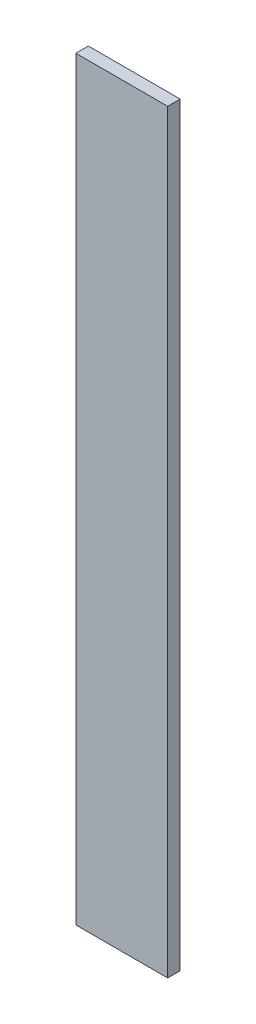
ISO-10303-21;
HEADER;
FILE_DESCRIPTION(('STEP AP214'),'2;1');
FILE_NAME('part.step','',(''),(''),'','','');
FILE_SCHEMA(('AUTOMOTIVE_DESIGN { 1 0 10303 214 1 1 1 1 }'));
ENDSEC;
DATA;
#1=APPLICATION_CONTEXT('core data for automotive mechanical design processes');
#2=APPLICATION_PROTOCOL_DEFINITION('international standard','automotive_design',2000,#1);
#3=PRODUCT_CONTEXT('',#1,'mechanical');
#4=PRODUCT('Part','Part','',(#3));
#5=PRODUCT_RELATED_PRODUCT_CATEGORY('part','',(#4));
#6=PRODUCT_DEFINITION_FORMATION('','',#4);
#7=PRODUCT_DEFINITION_CONTEXT('part definition',#1,'design');
#8=PRODUCT_DEFINITION('design','',#6,#7);
#9=PRODUCT_DEFINITION_SHAPE('','',#8);
#10=(LENGTH_UNIT() NAMED_UNIT(*) SI_UNIT(.MILLI.,.METRE.));
#11=(NAMED_UNIT(*) PLANE_ANGLE_UNIT() SI_UNIT($,.RADIAN.));
#12=(NAMED_UNIT(*) SI_UNIT($,.STERADIAN.) SOLID_ANGLE_UNIT());
#13=UNCERTAINTY_MEASURE_WITH_UNIT(LENGTH_MEASURE(1.E-05),#10,'distance_accuracy_value','');
#14=(GEOMETRIC_REPRESENTATION_CONTEXT(3) GLOBAL_UNCERTAINTY_ASSIGNED_CONTEXT((#13)) GLOBAL_UNIT_ASSIGNED_CONTEXT((#10,
#11,#12)) REPRESENTATION_CONTEXT('',''));
#15=CARTESIAN_POINT('',(0.,0.,0.));
#16=DIRECTION('',(0.,0.,1.));
#17=DIRECTION('',(1.,0.,0.));
#18=AXIS2_PLACEMENT_3D('',#15,#16,#17);
#19=CARTESIAN_POINT('',(0.,0.,0.1143));
#20=DIRECTION('',(0.,0.,1.));
#21=DIRECTION('',(1.,0.,0.));
#22=AXIS2_PLACEMENT_3D('',#19,#20,#21);
#23=PLANE('',#22);
#24=DIRECTION('',(0.,1.,0.));
#25=VECTOR('',#24,1.);
#26=CARTESIAN_POINT('',(-6.60999999999896,1.71999999999998,0.1143));
#27=LINE('',#26,#25);
#28=CARTESIAN_POINT('',(-6.60999999999896,4.01999999999916,0.1143));
#29=VERTEX_POINT('',#28);
#30=CARTESIAN_POINT('',(-6.60999999999896,1.71999999999998,0.1143));
#31=VERTEX_POINT('',#30);
#32=EDGE_CURVE('E68',#29,#31,#27,.F.);
#33=ORIENTED_EDGE('',*,*,#32,.F.);
#34=DIRECTION('',(1.,0.,0.));
#35=VECTOR('',#34,1.);
#36=CARTESIAN_POINT('',(-6.60999999999896,4.01999999999916,0.1143));
#37=LINE('',#36,#35);
#38=CARTESIAN_POINT('',(-6.89000000000038,4.01999999999916,0.1143));
#39=VERTEX_POINT('',#38);
#40=EDGE_CURVE('E20',#39,#29,#37,.T.);
#41=ORIENTED_EDGE('',*,*,#40,.F.);
#42=DIRECTION('',(0.,1.,0.));
#43=VECTOR('',#42,1.);
#44=CARTESIAN_POINT('',(-6.89000000000038,4.01999999999916,0.1143));
#45=LINE('',#44,#43);
#46=CARTESIAN_POINT('',(-6.89000000000038,1.71999999999998,0.1143));
#47=VERTEX_POINT('',#46);
#48=EDGE_CURVE('E58',#47,#39,#45,.T.);
#49=ORIENTED_EDGE('',*,*,#48,.F.);
#50=DIRECTION('',(1.,0.,0.));
#51=VECTOR('',#50,1.);
#52=CARTESIAN_POINT('',(-6.89000000000038,1.71999999999998,0.1143));
#53=LINE('',#52,#51);
#54=EDGE_CURVE('E53',#31,#47,#53,.F.);
#55=ORIENTED_EDGE('',*,*,#54,.F.);
#56=EDGE_LOOP('',(#33,#41,#49,#55));
#57=FACE_BOUND('',#56,.T.);
#58=ADVANCED_FACE('F17',(#57),#23,.T.);
#59=CARTESIAN_POINT('',(-6.60999999999896,4.01999999999916,0.0762));
#60=DIRECTION('',(0.,1.,0.));
#61=DIRECTION('',(0.,0.,1.));
#62=AXIS2_PLACEMENT_3D('',#59,#60,#61);
#63=PLANE('',#62);
#64=DIRECTION('',(0.,0.,-1.));
#65=VECTOR('',#64,1.);
#66=CARTESIAN_POINT('',(-6.60999999999896,4.01999999999916,0.0762));
#67=LINE('',#66,#65);
#68=CARTESIAN_POINT('',(-6.60999999999896,4.01999999999916,0.0762));
#69=VERTEX_POINT('',#68);
#70=EDGE_CURVE('E79',#69,#29,#67,.F.);
#71=ORIENTED_EDGE('',*,*,#70,.F.);
#72=DIRECTION('',(1.,0.,0.));
#73=VECTOR('',#72,1.);
#74=CARTESIAN_POINT('',(7.251827,4.01999999999916,0.0762));
#75=LINE('',#74,#73);
#76=CARTESIAN_POINT('',(-6.89000000000038,4.01999999999916,0.0762));
#77=VERTEX_POINT('',#76);
#78=EDGE_CURVE('E74',#69,#77,#75,.F.);
#79=ORIENTED_EDGE('',*,*,#78,.T.);
#80=DIRECTION('',(0.,0.,1.));
#81=VECTOR('',#80,1.);
#82=CARTESIAN_POINT('',(-6.89000000000038,4.01999999999916,0.0762));
#83=LINE('',#82,#81);
#84=EDGE_CURVE('E63',#39,#77,#83,.F.);
#85=ORIENTED_EDGE('',*,*,#84,.F.);
#86=ORIENTED_EDGE('',*,*,#40,.T.);
#87=EDGE_LOOP('',(#71,#79,#85,#86));
#88=FACE_BOUND('',#87,.T.);
#89=ADVANCED_FACE('F73',(#88),#63,.T.);
#90=CARTESIAN_POINT('',(-6.89000000000038,4.01999999999916,0.0762));
#91=DIRECTION('',(-1.,0.,0.));
#92=DIRECTION('',(0.,0.,1.));
#93=AXIS2_PLACEMENT_3D('',#90,#91,#92);
#94=PLANE('',#93);
#95=ORIENTED_EDGE('',*,*,#84,.T.);
#96=DIRECTION('',(0.,1.,0.));
#97=VECTOR('',#96,1.);
#98=CARTESIAN_POINT('',(-6.89000000000038,-2.83409204896738,0.0762));
#99=LINE('',#98,#97);
#100=CARTESIAN_POINT('',(-6.89000000000038,1.71999999999998,0.0762));
#101=VERTEX_POINT('',#100);
#102=EDGE_CURVE('E84',#77,#101,#99,.F.);
#103=ORIENTED_EDGE('',*,*,#102,.T.);
#104=DIRECTION('',(0.,0.,-1.));
#105=VECTOR('',#104,1.);
#106=CARTESIAN_POINT('',(-6.89000000000038,1.71999999999998,0.0762));
#107=LINE('',#106,#105);
#108=EDGE_CURVE('E65',#47,#101,#107,.T.);
#109=ORIENTED_EDGE('',*,*,#108,.F.);
#110=ORIENTED_EDGE('',*,*,#48,.T.);
#111=EDGE_LOOP('',(#95,#103,#109,#110));
#112=FACE_BOUND('',#111,.T.);
#113=ADVANCED_FACE('F60',(#112),#94,.T.);
#114=CARTESIAN_POINT('',(-6.89000000000038,1.71999999999998,0.0762));
#115=DIRECTION('',(0.,-1.,0.));
#116=DIRECTION('',(0.,0.,-1.));
#117=AXIS2_PLACEMENT_3D('',#114,#115,#116);
#118=PLANE('',#117);
#119=ORIENTED_EDGE('',*,*,#108,.T.);
#120=DIRECTION('',(1.,0.,0.));
#121=VECTOR('',#120,1.);
#122=CARTESIAN_POINT('',(7.251827,1.71999999999998,0.0762));
#123=LINE('',#122,#121);
#124=CARTESIAN_POINT('',(-6.60999999999896,1.71999999999998,0.0762));
#125=VERTEX_POINT('',#124);
#126=EDGE_CURVE('E26',#101,#125,#123,.T.);
#127=ORIENTED_EDGE('',*,*,#126,.T.);
#128=DIRECTION('',(0.,0.,-1.));
#129=VECTOR('',#128,1.);
#130=CARTESIAN_POINT('',(-6.60999999999896,1.71999999999998,0.0762));
#131=LINE('',#130,#129);
#132=EDGE_CURVE('E34',#31,#125,#131,.T.);
#133=ORIENTED_EDGE('',*,*,#132,.F.);
#134=ORIENTED_EDGE('',*,*,#54,.T.);
#135=EDGE_LOOP('',(#119,#127,#133,#134));
#136=FACE_BOUND('',#135,.T.);
#137=ADVANCED_FACE('F88',(#136),#118,.T.);
#138=CARTESIAN_POINT('',(-6.60999999999896,1.71999999999998,0.0762));
#139=DIRECTION('',(1.,0.,0.));
#140=DIRECTION('',(0.,0.,-1.));
#141=AXIS2_PLACEMENT_3D('',#138,#139,#140);
#142=PLANE('',#141);
#143=ORIENTED_EDGE('',*,*,#132,.T.);
#144=DIRECTION('',(0.,1.,0.));
#145=VECTOR('',#144,1.);
#146=CARTESIAN_POINT('',(-6.60999999999896,-2.83409204896738,0.0762));
#147=LINE('',#146,#145);
#148=EDGE_CURVE('E11',#125,#69,#147,.T.);
#149=ORIENTED_EDGE('',*,*,#148,.T.);
#150=ORIENTED_EDGE('',*,*,#70,.T.);
#151=ORIENTED_EDGE('',*,*,#32,.T.);
#152=EDGE_LOOP('',(#143,#149,#150,#151));
#153=FACE_BOUND('',#152,.T.);
#154=ADVANCED_FACE('F91',(#153),#142,.T.);
#155=CARTESIAN_POINT('',(7.251827,-2.83409204896738,0.0762));
#156=DIRECTION('',(0.,0.,1.));
#157=DIRECTION('',(1.,0.,0.));
#158=AXIS2_PLACEMENT_3D('',#155,#156,#157);
#159=PLANE('',#158);
#160=ORIENTED_EDGE('',*,*,#126,.F.);
#161=ORIENTED_EDGE('',*,*,#102,.F.);
#162=ORIENTED_EDGE('',*,*,#78,.F.);
#163=ORIENTED_EDGE('',*,*,#148,.F.);
#164=EDGE_LOOP('',(#160,#161,#162,#163));
#165=FACE_BOUND('',#164,.T.);
#166=ADVANCED_FACE('F90',(#165),#159,.F.);
#167=CLOSED_SHELL('',(#58,#89,#113,#137,#154,#166));
#168=MANIFOLD_SOLID_BREP('B1',#167);
#169=ADVANCED_BREP_SHAPE_REPRESENTATION('',(#18,#168),#14);
#170=SHAPE_DEFINITION_REPRESENTATION(#9,#169);
ENDSEC;
END-ISO-10303-21;
